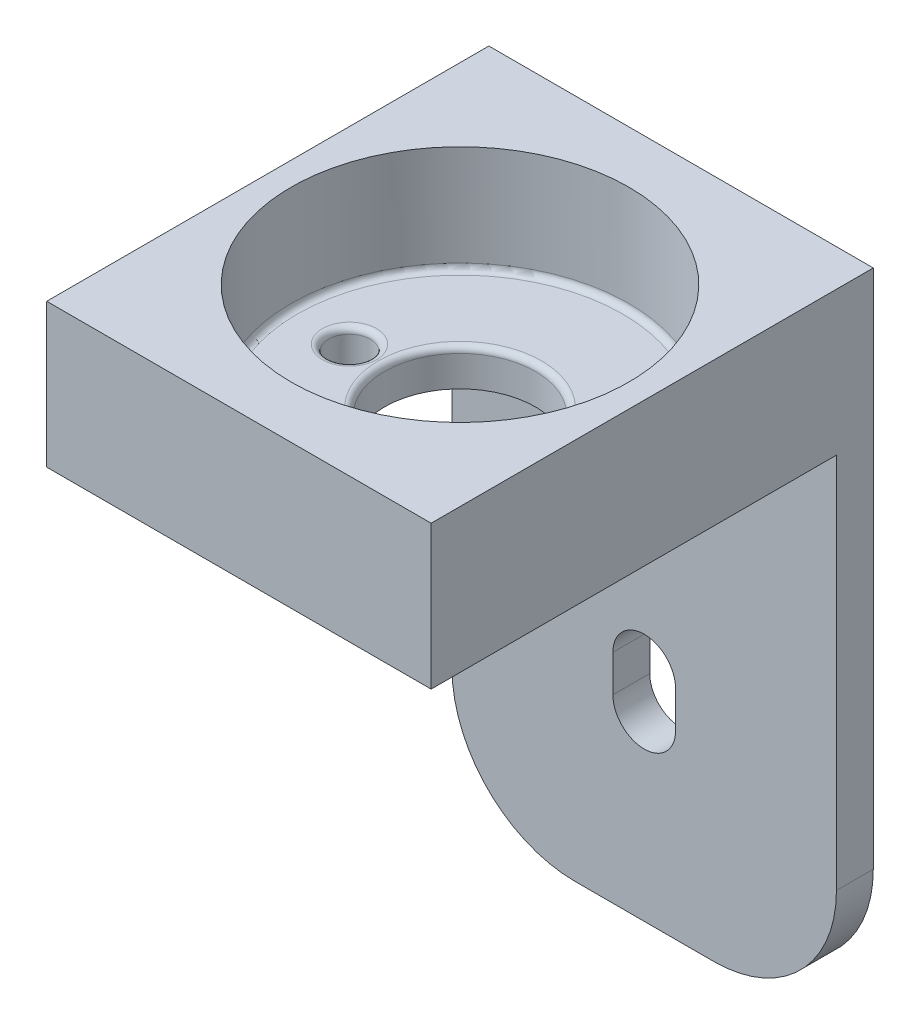
ISO-10303-21;
HEADER;
FILE_DESCRIPTION(('STEP AP214'),'2;1');
FILE_NAME('part.step','',(''),(''),'','','');
FILE_SCHEMA(('AUTOMOTIVE_DESIGN { 1 0 10303 214 1 1 1 1 }'));
ENDSEC;
DATA;
#1=APPLICATION_CONTEXT('core data for automotive mechanical design processes');
#2=APPLICATION_PROTOCOL_DEFINITION('international standard','automotive_design',2000,#1);
#3=PRODUCT_CONTEXT('',#1,'mechanical');
#4=PRODUCT('Part','Part','',(#3));
#5=PRODUCT_RELATED_PRODUCT_CATEGORY('part','',(#4));
#6=PRODUCT_DEFINITION_FORMATION('','',#4);
#7=PRODUCT_DEFINITION_CONTEXT('part definition',#1,'design');
#8=PRODUCT_DEFINITION('design','',#6,#7);
#9=PRODUCT_DEFINITION_SHAPE('','',#8);
#10=(LENGTH_UNIT() NAMED_UNIT(*) SI_UNIT(.MILLI.,.METRE.));
#11=(NAMED_UNIT(*) PLANE_ANGLE_UNIT() SI_UNIT($,.RADIAN.));
#12=(NAMED_UNIT(*) SI_UNIT($,.STERADIAN.) SOLID_ANGLE_UNIT());
#13=UNCERTAINTY_MEASURE_WITH_UNIT(LENGTH_MEASURE(1.E-05),#10,'distance_accuracy_value','');
#14=(GEOMETRIC_REPRESENTATION_CONTEXT(3) GLOBAL_UNCERTAINTY_ASSIGNED_CONTEXT((#13)) GLOBAL_UNIT_ASSIGNED_CONTEXT((#10,
#11,#12)) REPRESENTATION_CONTEXT('',''));
#15=CARTESIAN_POINT('',(0.,0.,0.));
#16=DIRECTION('',(0.,0.,1.));
#17=DIRECTION('',(1.,0.,0.));
#18=AXIS2_PLACEMENT_3D('',#15,#16,#17);
#19=CARTESIAN_POINT('',(0.,0.,3.));
#20=DIRECTION('',(0.,0.,-1.));
#21=DIRECTION('',(-1.,0.,0.));
#22=AXIS2_PLACEMENT_3D('',#19,#20,#21);
#23=PLANE('',#22);
#24=DIRECTION('',(0.,1.,0.));
#25=VECTOR('',#24,1.);
#26=CARTESIAN_POINT('',(2.55,-11.5,3.));
#27=LINE('',#26,#25);
#28=CARTESIAN_POINT('',(2.55,-11.5,3.));
#29=VERTEX_POINT('',#28);
#30=CARTESIAN_POINT('',(2.55,-8.5,3.));
#31=VERTEX_POINT('',#30);
#32=EDGE_CURVE('E669',#29,#31,#27,.T.);
#33=ORIENTED_EDGE('',*,*,#32,.F.);
#34=CARTESIAN_POINT('',(0.,-11.5,3.));
#35=DIRECTION('',(0.,0.,-1.));
#36=DIRECTION('',(-1.,0.,0.));
#37=AXIS2_PLACEMENT_3D('',#34,#35,#36);
#38=CIRCLE('',#37,2.55);
#39=CARTESIAN_POINT('',(-2.55,-11.5,3.));
#40=VERTEX_POINT('',#39);
#41=EDGE_CURVE('E195',#40,#29,#38,.F.);
#42=ORIENTED_EDGE('',*,*,#41,.F.);
#43=DIRECTION('',(0.,-1.,0.));
#44=VECTOR('',#43,1.);
#45=CARTESIAN_POINT('',(-2.55,-11.5,3.));
#46=LINE('',#45,#44);
#47=CARTESIAN_POINT('',(-2.55,-8.5,3.));
#48=VERTEX_POINT('',#47);
#49=EDGE_CURVE('E192',#48,#40,#46,.T.);
#50=ORIENTED_EDGE('',*,*,#49,.F.);
#51=CARTESIAN_POINT('',(0.,-8.5,3.));
#52=DIRECTION('',(0.,0.,-1.));
#53=DIRECTION('',(-1.,0.,0.));
#54=AXIS2_PLACEMENT_3D('',#51,#52,#53);
#55=CIRCLE('',#54,2.55);
#56=EDGE_CURVE('E165',#31,#48,#55,.F.);
#57=ORIENTED_EDGE('',*,*,#56,.F.);
#58=EDGE_LOOP('',(#33,#42,#50,#57));
#59=FACE_BOUND('',#58,.T.);
#60=DIRECTION('',(0.,1.,0.));
#61=VECTOR('',#60,1.);
#62=CARTESIAN_POINT('',(2.55,8.5,3.));
#63=LINE('',#62,#61);
#64=CARTESIAN_POINT('',(2.55,8.5,3.));
#65=VERTEX_POINT('',#64);
#66=CARTESIAN_POINT('',(2.55,11.5,3.));
#67=VERTEX_POINT('',#66);
#68=EDGE_CURVE('E221',#65,#67,#63,.T.);
#69=ORIENTED_EDGE('',*,*,#68,.F.);
#70=CARTESIAN_POINT('',(0.,8.5,3.));
#71=DIRECTION('',(0.,0.,-1.));
#72=DIRECTION('',(-1.,0.,0.));
#73=AXIS2_PLACEMENT_3D('',#70,#71,#72);
#74=CIRCLE('',#73,2.55);
#75=CARTESIAN_POINT('',(-2.55,8.5,3.));
#76=VERTEX_POINT('',#75);
#77=EDGE_CURVE('E198',#76,#65,#74,.F.);
#78=ORIENTED_EDGE('',*,*,#77,.F.);
#79=DIRECTION('',(0.,-1.,0.));
#80=VECTOR('',#79,1.);
#81=CARTESIAN_POINT('',(-2.55,8.5,3.));
#82=LINE('',#81,#80);
#83=CARTESIAN_POINT('',(-2.55,11.5,3.));
#84=VERTEX_POINT('',#83);
#85=EDGE_CURVE('E196',#84,#76,#82,.T.);
#86=ORIENTED_EDGE('',*,*,#85,.F.);
#87=CARTESIAN_POINT('',(0.,11.5,3.));
#88=DIRECTION('',(0.,0.,-1.));
#89=DIRECTION('',(-1.,0.,0.));
#90=AXIS2_PLACEMENT_3D('',#87,#88,#89);
#91=CIRCLE('',#90,2.55);
#92=EDGE_CURVE('E209',#67,#84,#91,.F.);
#93=ORIENTED_EDGE('',*,*,#92,.F.);
#94=EDGE_LOOP('',(#69,#78,#86,#93));
#95=FACE_BOUND('',#94,.T.);
#96=DIRECTION('',(1.,0.,0.));
#97=VECTOR('',#96,1.);
#98=CARTESIAN_POINT('',(15.65,-26.2,3.));
#99=LINE('',#98,#97);
#100=CARTESIAN_POINT('',(-5.65,-26.2,3.));
#101=VERTEX_POINT('',#100);
#102=CARTESIAN_POINT('',(5.65,-26.2,3.));
#103=VERTEX_POINT('',#102);
#104=EDGE_CURVE('E258',#101,#103,#99,.T.);
#105=ORIENTED_EDGE('',*,*,#104,.T.);
#106=CARTESIAN_POINT('',(5.65,-16.2,3.));
#107=DIRECTION('',(0.,0.,-1.));
#108=DIRECTION('',(-1.,0.,0.));
#109=AXIS2_PLACEMENT_3D('',#106,#107,#108);
#110=CIRCLE('',#109,10.);
#111=CARTESIAN_POINT('',(15.65,-16.2,3.));
#112=VERTEX_POINT('',#111);
#113=EDGE_CURVE('E50',#103,#112,#110,.F.);
#114=ORIENTED_EDGE('',*,*,#113,.T.);
#115=DIRECTION('',(0.,1.,0.));
#116=VECTOR('',#115,1.);
#117=CARTESIAN_POINT('',(15.65,26.2,3.));
#118=LINE('',#117,#116);
#119=CARTESIAN_POINT('',(15.65,14.5,3.));
#120=VERTEX_POINT('',#119);
#121=EDGE_CURVE('E261',#112,#120,#118,.T.);
#122=ORIENTED_EDGE('',*,*,#121,.T.);
#123=DIRECTION('',(1.,0.,0.));
#124=VECTOR('',#123,1.);
#125=CARTESIAN_POINT('',(15.65,14.5,3.));
#126=LINE('',#125,#124);
#127=CARTESIAN_POINT('',(-15.65,14.5,3.));
#128=VERTEX_POINT('',#127);
#129=EDGE_CURVE('E239',#128,#120,#126,.T.);
#130=ORIENTED_EDGE('',*,*,#129,.F.);
#131=DIRECTION('',(0.,-1.,0.));
#132=VECTOR('',#131,1.);
#133=CARTESIAN_POINT('',(-15.65,26.2,3.));
#134=LINE('',#133,#132);
#135=CARTESIAN_POINT('',(-15.65,-16.2,3.));
#136=VERTEX_POINT('',#135);
#137=EDGE_CURVE('E256',#128,#136,#134,.T.);
#138=ORIENTED_EDGE('',*,*,#137,.T.);
#139=CARTESIAN_POINT('',(-5.65,-16.2,3.));
#140=DIRECTION('',(0.,0.,-1.));
#141=DIRECTION('',(-1.,0.,0.));
#142=AXIS2_PLACEMENT_3D('',#139,#140,#141);
#143=CIRCLE('',#142,10.);
#144=EDGE_CURVE('E310',#136,#101,#143,.F.);
#145=ORIENTED_EDGE('',*,*,#144,.T.);
#146=EDGE_LOOP('',(#105,#114,#122,#130,#138,#145));
#147=FACE_BOUND('',#146,.T.);
#148=ADVANCED_FACE('F42',(#59,#95,#147),#23,.F.);
#149=CARTESIAN_POINT('',(-15.65,26.2,3.));
#150=DIRECTION('',(1.,0.,0.));
#151=DIRECTION('',(0.,0.,-1.));
#152=AXIS2_PLACEMENT_3D('',#149,#150,#151);
#153=PLANE('',#152);
#154=DIRECTION('',(0.,-1.,0.));
#155=VECTOR('',#154,1.);
#156=CARTESIAN_POINT('',(-15.65,26.2,0.));
#157=LINE('',#156,#155);
#158=CARTESIAN_POINT('',(-15.65,26.2,0.));
#159=VERTEX_POINT('',#158);
#160=CARTESIAN_POINT('',(-15.65,-16.2,0.));
#161=VERTEX_POINT('',#160);
#162=EDGE_CURVE('E255',#159,#161,#157,.T.);
#163=ORIENTED_EDGE('',*,*,#162,.T.);
#164=DIRECTION('',(0.,0.,-1.));
#165=VECTOR('',#164,1.);
#166=CARTESIAN_POINT('',(-15.65,-16.2,3.));
#167=LINE('',#166,#165);
#168=EDGE_CURVE('E12',#161,#136,#167,.F.);
#169=ORIENTED_EDGE('',*,*,#168,.T.);
#170=ORIENTED_EDGE('',*,*,#137,.F.);
#171=DIRECTION('',(0.,0.,-1.));
#172=VECTOR('',#171,1.);
#173=CARTESIAN_POINT('',(-15.65,14.5,36.));
#174=LINE('',#173,#172);
#175=CARTESIAN_POINT('',(-15.65,14.5,36.));
#176=VERTEX_POINT('',#175);
#177=EDGE_CURVE('E252',#176,#128,#174,.T.);
#178=ORIENTED_EDGE('',*,*,#177,.F.);
#179=DIRECTION('',(0.,-1.,0.));
#180=VECTOR('',#179,1.);
#181=CARTESIAN_POINT('',(-15.65,17.5,36.));
#182=LINE('',#181,#180);
#183=CARTESIAN_POINT('',(-15.65,26.2,36.));
#184=VERTEX_POINT('',#183);
#185=EDGE_CURVE('E243',#184,#176,#182,.T.);
#186=ORIENTED_EDGE('',*,*,#185,.F.);
#187=DIRECTION('',(0.,0.,-1.));
#188=VECTOR('',#187,1.);
#189=CARTESIAN_POINT('',(-15.65,26.2,3.));
#190=LINE('',#189,#188);
#191=EDGE_CURVE('E263',#184,#159,#190,.T.);
#192=ORIENTED_EDGE('',*,*,#191,.T.);
#193=EDGE_LOOP('',(#163,#169,#170,#178,#186,#192));
#194=FACE_BOUND('',#193,.T.);
#195=ADVANCED_FACE('F330',(#194),#153,.F.);
#196=CARTESIAN_POINT('',(15.65,-26.2,3.));
#197=DIRECTION('',(0.,1.,0.));
#198=DIRECTION('',(0.,0.,1.));
#199=AXIS2_PLACEMENT_3D('',#196,#197,#198);
#200=PLANE('',#199);
#201=DIRECTION('',(1.,0.,0.));
#202=VECTOR('',#201,1.);
#203=CARTESIAN_POINT('',(15.65,-26.2,0.));
#204=LINE('',#203,#202);
#205=CARTESIAN_POINT('',(-5.65,-26.2,0.));
#206=VERTEX_POINT('',#205);
#207=CARTESIAN_POINT('',(5.65,-26.2,0.));
#208=VERTEX_POINT('',#207);
#209=EDGE_CURVE('E265',#206,#208,#204,.T.);
#210=ORIENTED_EDGE('',*,*,#209,.T.);
#211=DIRECTION('',(0.,0.,-1.));
#212=VECTOR('',#211,1.);
#213=CARTESIAN_POINT('',(5.65,-26.2,3.));
#214=LINE('',#213,#212);
#215=EDGE_CURVE('E63',#208,#103,#214,.F.);
#216=ORIENTED_EDGE('',*,*,#215,.T.);
#217=ORIENTED_EDGE('',*,*,#104,.F.);
#218=DIRECTION('',(0.,0.,-1.));
#219=VECTOR('',#218,1.);
#220=CARTESIAN_POINT('',(-5.65,-26.2,3.));
#221=LINE('',#220,#219);
#222=EDGE_CURVE('E306',#101,#206,#221,.T.);
#223=ORIENTED_EDGE('',*,*,#222,.T.);
#224=EDGE_LOOP('',(#210,#216,#217,#223));
#225=FACE_BOUND('',#224,.T.);
#226=ADVANCED_FACE('F325',(#225),#200,.F.);
#227=CARTESIAN_POINT('',(15.65,26.2,3.));
#228=DIRECTION('',(-1.,0.,0.));
#229=DIRECTION('',(0.,0.,1.));
#230=AXIS2_PLACEMENT_3D('',#227,#228,#229);
#231=PLANE('',#230);
#232=ORIENTED_EDGE('',*,*,#121,.F.);
#233=DIRECTION('',(0.,0.,-1.));
#234=VECTOR('',#233,1.);
#235=CARTESIAN_POINT('',(15.65,-16.2,3.));
#236=LINE('',#235,#234);
#237=CARTESIAN_POINT('',(15.65,-16.2,0.));
#238=VERTEX_POINT('',#237);
#239=EDGE_CURVE('E299',#112,#238,#236,.T.);
#240=ORIENTED_EDGE('',*,*,#239,.T.);
#241=DIRECTION('',(0.,1.,0.));
#242=VECTOR('',#241,1.);
#243=CARTESIAN_POINT('',(15.65,26.2,0.));
#244=LINE('',#243,#242);
#245=CARTESIAN_POINT('',(15.65,26.2,0.));
#246=VERTEX_POINT('',#245);
#247=EDGE_CURVE('E267',#238,#246,#244,.T.);
#248=ORIENTED_EDGE('',*,*,#247,.T.);
#249=DIRECTION('',(0.,0.,-1.));
#250=VECTOR('',#249,1.);
#251=CARTESIAN_POINT('',(15.65,26.2,3.));
#252=LINE('',#251,#250);
#253=CARTESIAN_POINT('',(15.65,26.2,36.));
#254=VERTEX_POINT('',#253);
#255=EDGE_CURVE('E272',#254,#246,#252,.T.);
#256=ORIENTED_EDGE('',*,*,#255,.F.);
#257=DIRECTION('',(0.,1.,0.));
#258=VECTOR('',#257,1.);
#259=CARTESIAN_POINT('',(15.65,17.5,36.));
#260=LINE('',#259,#258);
#261=CARTESIAN_POINT('',(15.65,14.5,36.));
#262=VERTEX_POINT('',#261);
#263=EDGE_CURVE('E240',#262,#254,#260,.T.);
#264=ORIENTED_EDGE('',*,*,#263,.F.);
#265=DIRECTION('',(0.,0.,-1.));
#266=VECTOR('',#265,1.);
#267=CARTESIAN_POINT('',(15.65,14.5,36.));
#268=LINE('',#267,#266);
#269=EDGE_CURVE('E247',#262,#120,#268,.T.);
#270=ORIENTED_EDGE('',*,*,#269,.T.);
#271=EDGE_LOOP('',(#232,#240,#248,#256,#264,#270));
#272=FACE_BOUND('',#271,.T.);
#273=ADVANCED_FACE('F317',(#272),#231,.F.);
#274=CARTESIAN_POINT('',(15.65,26.2,3.));
#275=DIRECTION('',(0.,-1.,0.));
#276=DIRECTION('',(0.,0.,-1.));
#277=AXIS2_PLACEMENT_3D('',#274,#275,#276);
#278=PLANE('',#277);
#279=CARTESIAN_POINT('',(0.,26.2,18.));
#280=DIRECTION('',(0.,1.,0.));
#281=DIRECTION('',(0.,0.,1.));
#282=AXIS2_PLACEMENT_3D('',#279,#280,#281);
#283=CIRCLE('',#282,13.75);
#284=CARTESIAN_POINT('',(0.,26.2,31.75));
#285=VERTEX_POINT('',#284);
#286=EDGE_CURVE('E233',#285,#285,#283,.T.);
#287=ORIENTED_EDGE('',*,*,#286,.F.);
#288=EDGE_LOOP('',(#287));
#289=FACE_BOUND('',#288,.T.);
#290=DIRECTION('',(-1.,0.,0.));
#291=VECTOR('',#290,1.);
#292=CARTESIAN_POINT('',(15.65,26.2,0.));
#293=LINE('',#292,#291);
#294=EDGE_CURVE('E259',#246,#159,#293,.T.);
#295=ORIENTED_EDGE('',*,*,#294,.T.);
#296=ORIENTED_EDGE('',*,*,#191,.F.);
#297=DIRECTION('',(1.,0.,0.));
#298=VECTOR('',#297,1.);
#299=CARTESIAN_POINT('',(15.65,26.2,36.));
#300=LINE('',#299,#298);
#301=EDGE_CURVE('E236',#184,#254,#300,.T.);
#302=ORIENTED_EDGE('',*,*,#301,.T.);
#303=ORIENTED_EDGE('',*,*,#255,.T.);
#304=EDGE_LOOP('',(#295,#296,#302,#303));
#305=FACE_BOUND('',#304,.T.);
#306=ADVANCED_FACE('F335',(#289,#305),#278,.F.);
#307=CARTESIAN_POINT('',(0.,0.,0.));
#308=DIRECTION('',(0.,0.,-1.));
#309=DIRECTION('',(-1.,0.,0.));
#310=AXIS2_PLACEMENT_3D('',#307,#308,#309);
#311=PLANE('',#310);
#312=CARTESIAN_POINT('',(0.,-11.5,0.));
#313=DIRECTION('',(0.,0.,-1.));
#314=DIRECTION('',(-1.,0.,0.));
#315=AXIS2_PLACEMENT_3D('',#312,#313,#314);
#316=CIRCLE('',#315,2.55);
#317=CARTESIAN_POINT('',(2.55,-11.5,0.));
#318=VERTEX_POINT('',#317);
#319=CARTESIAN_POINT('',(-2.55,-11.5,0.));
#320=VERTEX_POINT('',#319);
#321=EDGE_CURVE('E178',#318,#320,#316,.T.);
#322=ORIENTED_EDGE('',*,*,#321,.F.);
#323=DIRECTION('',(0.,-1.,0.));
#324=VECTOR('',#323,1.);
#325=CARTESIAN_POINT('',(2.55,-11.5,0.));
#326=LINE('',#325,#324);
#327=CARTESIAN_POINT('',(2.55,-8.5,0.));
#328=VERTEX_POINT('',#327);
#329=EDGE_CURVE('E183',#328,#318,#326,.T.);
#330=ORIENTED_EDGE('',*,*,#329,.F.);
#331=CARTESIAN_POINT('',(0.,-8.5,0.));
#332=DIRECTION('',(0.,0.,-1.));
#333=DIRECTION('',(-1.,0.,0.));
#334=AXIS2_PLACEMENT_3D('',#331,#332,#333);
#335=CIRCLE('',#334,2.55);
#336=CARTESIAN_POINT('',(-2.55,-8.5,0.));
#337=VERTEX_POINT('',#336);
#338=EDGE_CURVE('E162',#337,#328,#335,.T.);
#339=ORIENTED_EDGE('',*,*,#338,.F.);
#340=DIRECTION('',(0.,1.,0.));
#341=VECTOR('',#340,1.);
#342=CARTESIAN_POINT('',(-2.55,-11.5,0.));
#343=LINE('',#342,#341);
#344=EDGE_CURVE('E173',#320,#337,#343,.T.);
#345=ORIENTED_EDGE('',*,*,#344,.F.);
#346=EDGE_LOOP('',(#322,#330,#339,#345));
#347=FACE_BOUND('',#346,.T.);
#348=CARTESIAN_POINT('',(0.,8.5,0.));
#349=DIRECTION('',(0.,0.,-1.));
#350=DIRECTION('',(-1.,0.,0.));
#351=AXIS2_PLACEMENT_3D('',#348,#349,#350);
#352=CIRCLE('',#351,2.55);
#353=CARTESIAN_POINT('',(2.55,8.5,0.));
#354=VERTEX_POINT('',#353);
#355=CARTESIAN_POINT('',(-2.55,8.5,0.));
#356=VERTEX_POINT('',#355);
#357=EDGE_CURVE('E218',#354,#356,#352,.T.);
#358=ORIENTED_EDGE('',*,*,#357,.F.);
#359=DIRECTION('',(0.,-1.,0.));
#360=VECTOR('',#359,1.);
#361=CARTESIAN_POINT('',(2.55,8.5,0.));
#362=LINE('',#361,#360);
#363=CARTESIAN_POINT('',(2.55,11.5,0.));
#364=VERTEX_POINT('',#363);
#365=EDGE_CURVE('E202',#364,#354,#362,.T.);
#366=ORIENTED_EDGE('',*,*,#365,.F.);
#367=CARTESIAN_POINT('',(0.,11.5,0.));
#368=DIRECTION('',(0.,0.,-1.));
#369=DIRECTION('',(-1.,0.,0.));
#370=AXIS2_PLACEMENT_3D('',#367,#368,#369);
#371=CIRCLE('',#370,2.55);
#372=CARTESIAN_POINT('',(-2.55,11.5,0.));
#373=VERTEX_POINT('',#372);
#374=EDGE_CURVE('E212',#373,#364,#371,.T.);
#375=ORIENTED_EDGE('',*,*,#374,.F.);
#376=DIRECTION('',(0.,1.,0.));
#377=VECTOR('',#376,1.);
#378=CARTESIAN_POINT('',(-2.55,8.5,0.));
#379=LINE('',#378,#377);
#380=EDGE_CURVE('E215',#356,#373,#379,.T.);
#381=ORIENTED_EDGE('',*,*,#380,.F.);
#382=EDGE_LOOP('',(#358,#366,#375,#381));
#383=FACE_BOUND('',#382,.T.);
#384=ORIENTED_EDGE('',*,*,#247,.F.);
#385=CARTESIAN_POINT('',(5.65,-16.2,0.));
#386=DIRECTION('',(0.,0.,-1.));
#387=DIRECTION('',(-1.,0.,0.));
#388=AXIS2_PLACEMENT_3D('',#385,#386,#387);
#389=CIRCLE('',#388,10.);
#390=EDGE_CURVE('E304',#238,#208,#389,.T.);
#391=ORIENTED_EDGE('',*,*,#390,.T.);
#392=ORIENTED_EDGE('',*,*,#209,.F.);
#393=CARTESIAN_POINT('',(-5.65,-16.2,0.));
#394=DIRECTION('',(0.,0.,-1.));
#395=DIRECTION('',(-1.,0.,0.));
#396=AXIS2_PLACEMENT_3D('',#393,#394,#395);
#397=CIRCLE('',#396,10.);
#398=EDGE_CURVE('E302',#206,#161,#397,.T.);
#399=ORIENTED_EDGE('',*,*,#398,.T.);
#400=ORIENTED_EDGE('',*,*,#162,.F.);
#401=ORIENTED_EDGE('',*,*,#294,.F.);
#402=EDGE_LOOP('',(#384,#391,#392,#399,#400,#401));
#403=FACE_BOUND('',#402,.T.);
#404=ADVANCED_FACE('F180',(#347,#383,#403),#311,.T.);
#405=CARTESIAN_POINT('',(15.65,14.5,36.));
#406=DIRECTION('',(0.,1.,0.));
#407=DIRECTION('',(-1.,0.,0.));
#408=AXIS2_PLACEMENT_3D('',#405,#406,#407);
#409=PLANE('',#408);
#410=CARTESIAN_POINT('',(-8.99999999999998,14.5,18.));
#411=DIRECTION('',(0.,1.,0.));
#412=DIRECTION('',(-1.,0.,0.));
#413=AXIS2_PLACEMENT_3D('',#410,#411,#412);
#414=CIRCLE('',#413,1.7);
#415=CARTESIAN_POINT('',(-10.7,14.5,18.));
#416=VERTEX_POINT('',#415);
#417=EDGE_CURVE('E227',#416,#416,#414,.F.);
#418=ORIENTED_EDGE('',*,*,#417,.F.);
#419=EDGE_LOOP('',(#418));
#420=FACE_BOUND('',#419,.T.);
#421=CARTESIAN_POINT('',(9.00000000000002,14.5,18.));
#422=DIRECTION('',(0.,1.,0.));
#423=DIRECTION('',(-1.,0.,0.));
#424=AXIS2_PLACEMENT_3D('',#421,#422,#423);
#425=CIRCLE('',#424,1.7);
#426=CARTESIAN_POINT('',(7.30000000000002,14.5,18.));
#427=VERTEX_POINT('',#426);
#428=EDGE_CURVE('E194',#427,#427,#425,.F.);
#429=ORIENTED_EDGE('',*,*,#428,.F.);
#430=EDGE_LOOP('',(#429));
#431=FACE_BOUND('',#430,.T.);
#432=CARTESIAN_POINT('',(0.,14.5,18.));
#433=DIRECTION('',(0.,1.,0.));
#434=DIRECTION('',(-1.,0.,0.));
#435=AXIS2_PLACEMENT_3D('',#432,#433,#434);
#436=CIRCLE('',#435,6.15);
#437=CARTESIAN_POINT('',(-6.14999999999998,14.5,18.));
#438=VERTEX_POINT('',#437);
#439=EDGE_CURVE('E230',#438,#438,#436,.F.);
#440=ORIENTED_EDGE('',*,*,#439,.F.);
#441=EDGE_LOOP('',(#440));
#442=FACE_BOUND('',#441,.T.);
#443=ORIENTED_EDGE('',*,*,#129,.T.);
#444=ORIENTED_EDGE('',*,*,#269,.F.);
#445=DIRECTION('',(1.,0.,0.));
#446=VECTOR('',#445,1.);
#447=CARTESIAN_POINT('',(15.65,14.5,36.));
#448=LINE('',#447,#446);
#449=EDGE_CURVE('E245',#176,#262,#448,.T.);
#450=ORIENTED_EDGE('',*,*,#449,.F.);
#451=ORIENTED_EDGE('',*,*,#177,.T.);
#452=EDGE_LOOP('',(#443,#444,#450,#451));
#453=FACE_BOUND('',#452,.T.);
#454=ADVANCED_FACE('F340',(#420,#431,#442,#453),#409,.F.);
#455=CARTESIAN_POINT('',(0.,0.,36.));
#456=DIRECTION('',(0.,0.,-1.));
#457=DIRECTION('',(-1.,0.,0.));
#458=AXIS2_PLACEMENT_3D('',#455,#456,#457);
#459=PLANE('',#458);
#460=ORIENTED_EDGE('',*,*,#263,.T.);
#461=ORIENTED_EDGE('',*,*,#301,.F.);
#462=ORIENTED_EDGE('',*,*,#185,.T.);
#463=ORIENTED_EDGE('',*,*,#449,.T.);
#464=EDGE_LOOP('',(#460,#461,#462,#463));
#465=FACE_BOUND('',#464,.T.);
#466=ADVANCED_FACE('F337',(#465),#459,.F.);
#467=CARTESIAN_POINT('',(0.,-24.3908729652601,18.));
#468=DIRECTION('',(0.,1.,0.));
#469=DIRECTION('',(0.,0.,1.));
#470=AXIS2_PLACEMENT_3D('',#467,#468,#469);
#471=CYLINDRICAL_SURFACE('',#470,13.75);
#472=CARTESIAN_POINT('',(0.,18.,18.));
#473=DIRECTION('',(0.,1.,0.));
#474=DIRECTION('',(-1.,0.,0.));
#475=AXIS2_PLACEMENT_3D('',#472,#473,#474);
#476=CIRCLE('',#475,13.75);
#477=CARTESIAN_POINT('',(-13.75,18.,18.));
#478=VERTEX_POINT('',#477);
#479=EDGE_CURVE('E275',#478,#478,#476,.F.);
#480=ORIENTED_EDGE('',*,*,#479,.T.);
#481=EDGE_LOOP('',(#480));
#482=FACE_BOUND('',#481,.T.);
#483=ORIENTED_EDGE('',*,*,#286,.T.);
#484=EDGE_LOOP('',(#483));
#485=FACE_BOUND('',#484,.T.);
#486=ADVANCED_FACE('F348',(#482,#485),#471,.F.);
#487=CARTESIAN_POINT('',(15.65,17.5,36.));
#488=DIRECTION('',(0.,1.,0.));
#489=DIRECTION('',(-1.,0.,0.));
#490=AXIS2_PLACEMENT_3D('',#487,#488,#489);
#491=PLANE('',#490);
#492=CARTESIAN_POINT('',(0.,17.5,18.));
#493=DIRECTION('',(0.,1.,0.));
#494=DIRECTION('',(-1.,0.,0.));
#495=AXIS2_PLACEMENT_3D('',#492,#493,#494);
#496=CIRCLE('',#495,13.25);
#497=CARTESIAN_POINT('',(-13.25,17.5,18.));
#498=VERTEX_POINT('',#497);
#499=EDGE_CURVE('E287',#498,#498,#496,.T.);
#500=ORIENTED_EDGE('',*,*,#499,.T.);
#501=EDGE_LOOP('',(#500));
#502=FACE_BOUND('',#501,.T.);
#503=CARTESIAN_POINT('',(0.,17.5,18.));
#504=DIRECTION('',(0.,1.,0.));
#505=DIRECTION('',(-1.,0.,0.));
#506=AXIS2_PLACEMENT_3D('',#503,#504,#505);
#507=CIRCLE('',#506,6.65);
#508=CARTESIAN_POINT('',(-6.64999999999998,17.5,18.));
#509=VERTEX_POINT('',#508);
#510=EDGE_CURVE('E284',#509,#509,#507,.F.);
#511=ORIENTED_EDGE('',*,*,#510,.T.);
#512=EDGE_LOOP('',(#511));
#513=FACE_BOUND('',#512,.T.);
#514=CARTESIAN_POINT('',(9.00000000000002,17.5,18.));
#515=DIRECTION('',(0.,1.,0.));
#516=DIRECTION('',(-1.,0.,0.));
#517=AXIS2_PLACEMENT_3D('',#514,#515,#516);
#518=CIRCLE('',#517,2.2);
#519=CARTESIAN_POINT('',(6.80000000000002,17.5,18.));
#520=VERTEX_POINT('',#519);
#521=EDGE_CURVE('E281',#520,#520,#518,.F.);
#522=ORIENTED_EDGE('',*,*,#521,.T.);
#523=EDGE_LOOP('',(#522));
#524=FACE_BOUND('',#523,.T.);
#525=CARTESIAN_POINT('',(-8.99999999999998,17.5,18.));
#526=DIRECTION('',(0.,1.,0.));
#527=DIRECTION('',(-1.,0.,0.));
#528=AXIS2_PLACEMENT_3D('',#525,#526,#527);
#529=CIRCLE('',#528,2.2);
#530=CARTESIAN_POINT('',(-11.2,17.5,18.));
#531=VERTEX_POINT('',#530);
#532=EDGE_CURVE('E278',#531,#531,#529,.F.);
#533=ORIENTED_EDGE('',*,*,#532,.T.);
#534=EDGE_LOOP('',(#533));
#535=FACE_BOUND('',#534,.T.);
#536=ADVANCED_FACE('F429',(#502,#513,#524,#535),#491,.T.);
#537=CARTESIAN_POINT('',(0.,-2.89482681718908,18.));
#538=DIRECTION('',(0.,1.,0.));
#539=DIRECTION('',(-1.,0.,0.));
#540=AXIS2_PLACEMENT_3D('',#537,#538,#539);
#541=CYLINDRICAL_SURFACE('',#540,6.15);
#542=CARTESIAN_POINT('',(0.,17.,18.));
#543=DIRECTION('',(0.,1.,0.));
#544=DIRECTION('',(-1.,0.,0.));
#545=AXIS2_PLACEMENT_3D('',#542,#543,#544);
#546=CIRCLE('',#545,6.15);
#547=CARTESIAN_POINT('',(-6.14999999999998,17.,18.));
#548=VERTEX_POINT('',#547);
#549=EDGE_CURVE('E290',#548,#548,#546,.T.);
#550=ORIENTED_EDGE('',*,*,#549,.T.);
#551=EDGE_LOOP('',(#550));
#552=FACE_BOUND('',#551,.T.);
#553=ORIENTED_EDGE('',*,*,#439,.T.);
#554=EDGE_LOOP('',(#553));
#555=FACE_BOUND('',#554,.T.);
#556=ADVANCED_FACE('F425',(#552,#555),#541,.F.);
#557=CARTESIAN_POINT('',(9.00000000000002,-31.0083261120685,18.));
#558=DIRECTION('',(0.,1.,0.));
#559=DIRECTION('',(-1.,0.,0.));
#560=AXIS2_PLACEMENT_3D('',#557,#558,#559);
#561=CYLINDRICAL_SURFACE('',#560,1.7);
#562=CARTESIAN_POINT('',(9.00000000000002,17.,18.));
#563=DIRECTION('',(0.,1.,0.));
#564=DIRECTION('',(-1.,0.,0.));
#565=AXIS2_PLACEMENT_3D('',#562,#563,#564);
#566=CIRCLE('',#565,1.7);
#567=CARTESIAN_POINT('',(7.30000000000002,17.,18.));
#568=VERTEX_POINT('',#567);
#569=EDGE_CURVE('E293',#568,#568,#566,.T.);
#570=ORIENTED_EDGE('',*,*,#569,.T.);
#571=EDGE_LOOP('',(#570));
#572=FACE_BOUND('',#571,.T.);
#573=ORIENTED_EDGE('',*,*,#428,.T.);
#574=EDGE_LOOP('',(#573));
#575=FACE_BOUND('',#574,.T.);
#576=ADVANCED_FACE('F421',(#572,#575),#561,.F.);
#577=CARTESIAN_POINT('',(-8.99999999999998,-31.0083261120685,18.));
#578=DIRECTION('',(0.,1.,0.));
#579=DIRECTION('',(-1.,0.,0.));
#580=AXIS2_PLACEMENT_3D('',#577,#578,#579);
#581=CYLINDRICAL_SURFACE('',#580,1.7);
#582=CARTESIAN_POINT('',(-8.99999999999998,17.,18.));
#583=DIRECTION('',(0.,1.,0.));
#584=DIRECTION('',(-1.,0.,0.));
#585=AXIS2_PLACEMENT_3D('',#582,#583,#584);
#586=CIRCLE('',#585,1.7);
#587=CARTESIAN_POINT('',(-10.7,17.,18.));
#588=VERTEX_POINT('',#587);
#589=EDGE_CURVE('E296',#588,#588,#586,.T.);
#590=ORIENTED_EDGE('',*,*,#589,.T.);
#591=EDGE_LOOP('',(#590));
#592=FACE_BOUND('',#591,.T.);
#593=ORIENTED_EDGE('',*,*,#417,.T.);
#594=EDGE_LOOP('',(#593));
#595=FACE_BOUND('',#594,.T.);
#596=ADVANCED_FACE('F374',(#592,#595),#581,.F.);
#597=CARTESIAN_POINT('',(0.,18.,18.));
#598=DIRECTION('',(0.,1.,0.));
#599=DIRECTION('',(-1.,0.,0.));
#600=AXIS2_PLACEMENT_3D('',#597,#598,#599);
#601=TOROIDAL_SURFACE('',#600,13.25,0.5);
#602=ORIENTED_EDGE('',*,*,#499,.F.);
#603=EDGE_LOOP('',(#602));
#604=FACE_BOUND('',#603,.T.);
#605=ORIENTED_EDGE('',*,*,#479,.F.);
#606=EDGE_LOOP('',(#605));
#607=FACE_BOUND('',#606,.T.);
#608=ADVANCED_FACE('F370',(#604,#607),#601,.F.);
#609=CARTESIAN_POINT('',(0.,17.,18.));
#610=DIRECTION('',(0.,1.,0.));
#611=DIRECTION('',(-1.,0.,0.));
#612=AXIS2_PLACEMENT_3D('',#609,#610,#611);
#613=TOROIDAL_SURFACE('',#612,6.65,0.5);
#614=ORIENTED_EDGE('',*,*,#510,.F.);
#615=EDGE_LOOP('',(#614));
#616=FACE_BOUND('',#615,.T.);
#617=ORIENTED_EDGE('',*,*,#549,.F.);
#618=EDGE_LOOP('',(#617));
#619=FACE_BOUND('',#618,.T.);
#620=ADVANCED_FACE('F373',(#616,#619),#613,.T.);
#621=CARTESIAN_POINT('',(9.00000000000002,17.,18.));
#622=DIRECTION('',(0.,1.,0.));
#623=DIRECTION('',(-1.,0.,0.));
#624=AXIS2_PLACEMENT_3D('',#621,#622,#623);
#625=TOROIDAL_SURFACE('',#624,2.2,0.5);
#626=ORIENTED_EDGE('',*,*,#569,.F.);
#627=EDGE_LOOP('',(#626));
#628=FACE_BOUND('',#627,.T.);
#629=ORIENTED_EDGE('',*,*,#521,.F.);
#630=EDGE_LOOP('',(#629));
#631=FACE_BOUND('',#630,.T.);
#632=ADVANCED_FACE('F378',(#628,#631),#625,.T.);
#633=CARTESIAN_POINT('',(-8.99999999999998,17.,18.));
#634=DIRECTION('',(0.,1.,0.));
#635=DIRECTION('',(-1.,0.,0.));
#636=AXIS2_PLACEMENT_3D('',#633,#634,#635);
#637=TOROIDAL_SURFACE('',#636,2.2,0.5);
#638=ORIENTED_EDGE('',*,*,#589,.F.);
#639=EDGE_LOOP('',(#638));
#640=FACE_BOUND('',#639,.T.);
#641=ORIENTED_EDGE('',*,*,#532,.F.);
#642=EDGE_LOOP('',(#641));
#643=FACE_BOUND('',#642,.T.);
#644=ADVANCED_FACE('F382',(#640,#643),#637,.T.);
#645=CARTESIAN_POINT('',(0.,8.5,12.5718336801263));
#646=DIRECTION('',(0.,0.,-1.));
#647=DIRECTION('',(-1.,0.,0.));
#648=AXIS2_PLACEMENT_3D('',#645,#646,#647);
#649=CYLINDRICAL_SURFACE('',#648,2.55);
#650=ORIENTED_EDGE('',*,*,#77,.T.);
#651=DIRECTION('',(0.,0.,-1.));
#652=VECTOR('',#651,1.);
#653=CARTESIAN_POINT('',(2.55,8.5,12.5718336801263));
#654=LINE('',#653,#652);
#655=EDGE_CURVE('E207',#65,#354,#654,.T.);
#656=ORIENTED_EDGE('',*,*,#655,.T.);
#657=ORIENTED_EDGE('',*,*,#357,.T.);
#658=DIRECTION('',(0.,0.,-1.));
#659=VECTOR('',#658,1.);
#660=CARTESIAN_POINT('',(-2.55,8.5,12.5718336801263));
#661=LINE('',#660,#659);
#662=EDGE_CURVE('E199',#76,#356,#661,.T.);
#663=ORIENTED_EDGE('',*,*,#662,.F.);
#664=EDGE_LOOP('',(#650,#656,#657,#663));
#665=FACE_BOUND('',#664,.T.);
#666=ADVANCED_FACE('F385',(#665),#649,.F.);
#667=CARTESIAN_POINT('',(2.55,8.5,12.5718336801263));
#668=DIRECTION('',(1.,0.,0.));
#669=DIRECTION('',(0.,1.,0.));
#670=AXIS2_PLACEMENT_3D('',#667,#668,#669);
#671=PLANE('',#670);
#672=ORIENTED_EDGE('',*,*,#68,.T.);
#673=DIRECTION('',(0.,0.,-1.));
#674=VECTOR('',#673,1.);
#675=CARTESIAN_POINT('',(2.55,11.5,12.5718336801263));
#676=LINE('',#675,#674);
#677=EDGE_CURVE('E205',#67,#364,#676,.T.);
#678=ORIENTED_EDGE('',*,*,#677,.T.);
#679=ORIENTED_EDGE('',*,*,#365,.T.);
#680=ORIENTED_EDGE('',*,*,#655,.F.);
#681=EDGE_LOOP('',(#672,#678,#679,#680));
#682=FACE_BOUND('',#681,.T.);
#683=ADVANCED_FACE('F407',(#682),#671,.F.);
#684=CARTESIAN_POINT('',(0.,11.5,12.5718336801263));
#685=DIRECTION('',(0.,0.,-1.));
#686=DIRECTION('',(-1.,0.,0.));
#687=AXIS2_PLACEMENT_3D('',#684,#685,#686);
#688=CYLINDRICAL_SURFACE('',#687,2.55);
#689=ORIENTED_EDGE('',*,*,#92,.T.);
#690=DIRECTION('',(0.,0.,-1.));
#691=VECTOR('',#690,1.);
#692=CARTESIAN_POINT('',(-2.55,11.5,12.5718336801263));
#693=LINE('',#692,#691);
#694=EDGE_CURVE('E203',#84,#373,#693,.T.);
#695=ORIENTED_EDGE('',*,*,#694,.T.);
#696=ORIENTED_EDGE('',*,*,#374,.T.);
#697=ORIENTED_EDGE('',*,*,#677,.F.);
#698=EDGE_LOOP('',(#689,#695,#696,#697));
#699=FACE_BOUND('',#698,.T.);
#700=ADVANCED_FACE('F411',(#699),#688,.F.);
#701=CARTESIAN_POINT('',(-2.55,8.5,12.5718336801263));
#702=DIRECTION('',(-1.,0.,0.));
#703=DIRECTION('',(0.,-1.,0.));
#704=AXIS2_PLACEMENT_3D('',#701,#702,#703);
#705=PLANE('',#704);
#706=ORIENTED_EDGE('',*,*,#85,.T.);
#707=ORIENTED_EDGE('',*,*,#662,.T.);
#708=ORIENTED_EDGE('',*,*,#380,.T.);
#709=ORIENTED_EDGE('',*,*,#694,.F.);
#710=EDGE_LOOP('',(#706,#707,#708,#709));
#711=FACE_BOUND('',#710,.T.);
#712=ADVANCED_FACE('F403',(#711),#705,.F.);
#713=CARTESIAN_POINT('',(0.,-11.5,12.5718336801263));
#714=DIRECTION('',(0.,0.,-1.));
#715=DIRECTION('',(-1.,0.,0.));
#716=AXIS2_PLACEMENT_3D('',#713,#714,#715);
#717=CYLINDRICAL_SURFACE('',#716,2.55);
#718=ORIENTED_EDGE('',*,*,#41,.T.);
#719=DIRECTION('',(0.,0.,-1.));
#720=VECTOR('',#719,1.);
#721=CARTESIAN_POINT('',(2.55,-11.5,12.5718336801263));
#722=LINE('',#721,#720);
#723=EDGE_CURVE('E188',#29,#318,#722,.T.);
#724=ORIENTED_EDGE('',*,*,#723,.T.);
#725=ORIENTED_EDGE('',*,*,#321,.T.);
#726=DIRECTION('',(0.,0.,-1.));
#727=VECTOR('',#726,1.);
#728=CARTESIAN_POINT('',(-2.55,-11.5,12.5718336801263));
#729=LINE('',#728,#727);
#730=EDGE_CURVE('E169',#40,#320,#729,.T.);
#731=ORIENTED_EDGE('',*,*,#730,.F.);
#732=EDGE_LOOP('',(#718,#724,#725,#731));
#733=FACE_BOUND('',#732,.T.);
#734=ADVANCED_FACE('F400',(#733),#717,.F.);
#735=CARTESIAN_POINT('',(2.55,-11.5,12.5718336801263));
#736=DIRECTION('',(1.,0.,0.));
#737=DIRECTION('',(0.,1.,0.));
#738=AXIS2_PLACEMENT_3D('',#735,#736,#737);
#739=PLANE('',#738);
#740=ORIENTED_EDGE('',*,*,#32,.T.);
#741=DIRECTION('',(0.,0.,-1.));
#742=VECTOR('',#741,1.);
#743=CARTESIAN_POINT('',(2.55,-8.5,12.5718336801263));
#744=LINE('',#743,#742);
#745=EDGE_CURVE('E168',#31,#328,#744,.T.);
#746=ORIENTED_EDGE('',*,*,#745,.T.);
#747=ORIENTED_EDGE('',*,*,#329,.T.);
#748=ORIENTED_EDGE('',*,*,#723,.F.);
#749=EDGE_LOOP('',(#740,#746,#747,#748));
#750=FACE_BOUND('',#749,.T.);
#751=ADVANCED_FACE('F396',(#750),#739,.F.);
#752=CARTESIAN_POINT('',(0.,-8.5,12.5718336801263));
#753=DIRECTION('',(0.,0.,-1.));
#754=DIRECTION('',(-1.,0.,0.));
#755=AXIS2_PLACEMENT_3D('',#752,#753,#754);
#756=CYLINDRICAL_SURFACE('',#755,2.55);
#757=ORIENTED_EDGE('',*,*,#56,.T.);
#758=DIRECTION('',(0.,0.,-1.));
#759=VECTOR('',#758,1.);
#760=CARTESIAN_POINT('',(-2.55,-8.5,12.5718336801263));
#761=LINE('',#760,#759);
#762=EDGE_CURVE('E157',#48,#337,#761,.T.);
#763=ORIENTED_EDGE('',*,*,#762,.T.);
#764=ORIENTED_EDGE('',*,*,#338,.T.);
#765=ORIENTED_EDGE('',*,*,#745,.F.);
#766=EDGE_LOOP('',(#757,#763,#764,#765));
#767=FACE_BOUND('',#766,.T.);
#768=ADVANCED_FACE('F159',(#767),#756,.F.);
#769=CARTESIAN_POINT('',(-2.55,-11.5,12.5718336801263));
#770=DIRECTION('',(-1.,0.,0.));
#771=DIRECTION('',(0.,-1.,0.));
#772=AXIS2_PLACEMENT_3D('',#769,#770,#771);
#773=PLANE('',#772);
#774=ORIENTED_EDGE('',*,*,#49,.T.);
#775=ORIENTED_EDGE('',*,*,#730,.T.);
#776=ORIENTED_EDGE('',*,*,#344,.T.);
#777=ORIENTED_EDGE('',*,*,#762,.F.);
#778=EDGE_LOOP('',(#774,#775,#776,#777));
#779=FACE_BOUND('',#778,.T.);
#780=ADVANCED_FACE('F174',(#779),#773,.F.);
#781=CARTESIAN_POINT('',(5.65,-16.2,3.));
#782=DIRECTION('',(0.,0.,-1.));
#783=DIRECTION('',(-1.,0.,0.));
#784=AXIS2_PLACEMENT_3D('',#781,#782,#783);
#785=CYLINDRICAL_SURFACE('',#784,10.);
#786=ORIENTED_EDGE('',*,*,#113,.F.);
#787=ORIENTED_EDGE('',*,*,#215,.F.);
#788=ORIENTED_EDGE('',*,*,#390,.F.);
#789=ORIENTED_EDGE('',*,*,#239,.F.);
#790=EDGE_LOOP('',(#786,#787,#788,#789));
#791=FACE_BOUND('',#790,.T.);
#792=ADVANCED_FACE('F321',(#791),#785,.T.);
#793=CARTESIAN_POINT('',(-5.65,-16.2,3.));
#794=DIRECTION('',(0.,0.,-1.));
#795=DIRECTION('',(-1.,0.,0.));
#796=AXIS2_PLACEMENT_3D('',#793,#794,#795);
#797=CYLINDRICAL_SURFACE('',#796,10.);
#798=ORIENTED_EDGE('',*,*,#144,.F.);
#799=ORIENTED_EDGE('',*,*,#168,.F.);
#800=ORIENTED_EDGE('',*,*,#398,.F.);
#801=ORIENTED_EDGE('',*,*,#222,.F.);
#802=EDGE_LOOP('',(#798,#799,#800,#801));
#803=FACE_BOUND('',#802,.T.);
#804=ADVANCED_FACE('F44',(#803),#797,.T.);
#805=CLOSED_SHELL('',(#148,#195,#226,#273,#306,#404,#454,#466,#486,#536,#556,#576,#596,#608,
#620,#632,#644,#666,#683,#700,#712,#734,#751,#768,#780,#792,#804));
#806=MANIFOLD_SOLID_BREP('B2',#805);
#807=ADVANCED_BREP_SHAPE_REPRESENTATION('',(#18,#806),#14);
#808=SHAPE_DEFINITION_REPRESENTATION(#9,#807);
ENDSEC;
END-ISO-10303-21;
